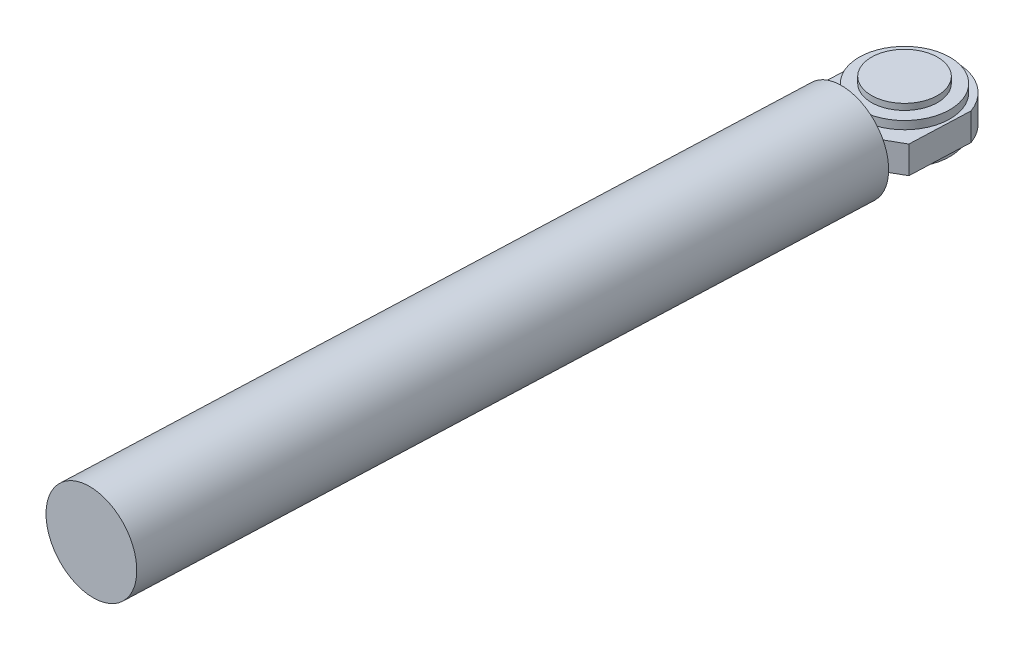
ISO-10303-21;
HEADER;
FILE_DESCRIPTION(('STEP AP214'),'2;1');
FILE_NAME('part.step','',(''),(''),'','','');
FILE_SCHEMA(('AUTOMOTIVE_DESIGN { 1 0 10303 214 1 1 1 1 }'));
ENDSEC;
DATA;
#1=APPLICATION_CONTEXT('core data for automotive mechanical design processes');
#2=APPLICATION_PROTOCOL_DEFINITION('international standard','automotive_design',2000,#1);
#3=PRODUCT_CONTEXT('',#1,'mechanical');
#4=PRODUCT('Part','Part','',(#3));
#5=PRODUCT_RELATED_PRODUCT_CATEGORY('part','',(#4));
#6=PRODUCT_DEFINITION_FORMATION('','',#4);
#7=PRODUCT_DEFINITION_CONTEXT('part definition',#1,'design');
#8=PRODUCT_DEFINITION('design','',#6,#7);
#9=PRODUCT_DEFINITION_SHAPE('','',#8);
#10=(LENGTH_UNIT() NAMED_UNIT(*) SI_UNIT(.MILLI.,.METRE.));
#11=(NAMED_UNIT(*) PLANE_ANGLE_UNIT() SI_UNIT($,.RADIAN.));
#12=(NAMED_UNIT(*) SI_UNIT($,.STERADIAN.) SOLID_ANGLE_UNIT());
#13=UNCERTAINTY_MEASURE_WITH_UNIT(LENGTH_MEASURE(1.E-05),#10,'distance_accuracy_value','');
#14=(GEOMETRIC_REPRESENTATION_CONTEXT(3) GLOBAL_UNCERTAINTY_ASSIGNED_CONTEXT((#13)) GLOBAL_UNIT_ASSIGNED_CONTEXT((#10,
#11,#12)) REPRESENTATION_CONTEXT('',''));
#15=CARTESIAN_POINT('',(0.,0.,0.));
#16=DIRECTION('',(0.,0.,1.));
#17=DIRECTION('',(1.,0.,0.));
#18=AXIS2_PLACEMENT_3D('',#15,#16,#17);
#19=CARTESIAN_POINT('',(339.664333773621,300.5,1096.72639959135));
#20=DIRECTION('',(0.,1.,0.));
#21=DIRECTION('',(0.,0.,1.));
#22=AXIS2_PLACEMENT_3D('',#19,#20,#21);
#23=PLANE('',#22);
#24=CARTESIAN_POINT('',(339.664333773621,300.5,1096.72639959135));
#25=DIRECTION('',(0.,-1.,0.));
#26=DIRECTION('',(0.,0.,-1.));
#27=AXIS2_PLACEMENT_3D('',#24,#25,#26);
#28=CIRCLE('',#27,35.0000000000001);
#29=CARTESIAN_POINT('',(339.664333773621,300.5,1061.72639959135));
#30=VERTEX_POINT('',#29);
#31=EDGE_CURVE('E18',#30,#30,#28,.T.);
#32=ORIENTED_EDGE('',*,*,#31,.F.);
#33=EDGE_LOOP('',(#32));
#34=FACE_BOUND('',#33,.T.);
#35=ADVANCED_FACE('F15',(#34),#23,.T.);
#36=CARTESIAN_POINT('',(339.664333773621,291.,1096.72639959135));
#37=DIRECTION('',(0.,-1.,0.));
#38=DIRECTION('',(0.,0.,-1.));
#39=AXIS2_PLACEMENT_3D('',#36,#37,#38);
#40=PLANE('',#39);
#41=CARTESIAN_POINT('',(339.664333773621,291.,1096.72639959135));
#42=DIRECTION('',(0.,-1.,0.));
#43=DIRECTION('',(0.,0.,-1.));
#44=AXIS2_PLACEMENT_3D('',#41,#42,#43);
#45=CIRCLE('',#44,20.);
#46=CARTESIAN_POINT('',(339.664333773621,291.,1076.72639959135));
#47=VERTEX_POINT('',#46);
#48=EDGE_CURVE('E142',#47,#47,#45,.T.);
#49=ORIENTED_EDGE('',*,*,#48,.T.);
#50=EDGE_LOOP('',(#49));
#51=FACE_BOUND('',#50,.T.);
#52=ADVANCED_FACE('F152',(#51),#40,.T.);
#53=CARTESIAN_POINT('',(339.664333773621,300.5,1096.72639959135));
#54=DIRECTION('',(0.,-1.,0.));
#55=DIRECTION('',(0.,0.,-1.));
#56=AXIS2_PLACEMENT_3D('',#53,#54,#55);
#57=CYLINDRICAL_SURFACE('',#56,35.0000000000001);
#58=CARTESIAN_POINT('',(339.664333773621,294.,1096.72639959135));
#59=DIRECTION('',(0.,-1.,0.));
#60=DIRECTION('',(0.,0.,-1.));
#61=AXIS2_PLACEMENT_3D('',#58,#59,#60);
#62=CIRCLE('',#61,35.0000000000001);
#63=CARTESIAN_POINT('',(339.664333773621,294.,1061.72639959135));
#64=VERTEX_POINT('',#63);
#65=EDGE_CURVE('E140',#64,#64,#62,.T.);
#66=ORIENTED_EDGE('',*,*,#65,.F.);
#67=EDGE_LOOP('',(#66));
#68=FACE_BOUND('',#67,.T.);
#69=ORIENTED_EDGE('',*,*,#31,.T.);
#70=EDGE_LOOP('',(#69));
#71=FACE_BOUND('',#70,.T.);
#72=ADVANCED_FACE('F149',(#68,#71),#57,.T.);
#73=CARTESIAN_POINT('',(339.664333773621,291.,1096.72639959135));
#74=DIRECTION('',(0.,-1.,0.));
#75=DIRECTION('',(0.,0.,-1.));
#76=AXIS2_PLACEMENT_3D('',#73,#74,#75);
#77=CYLINDRICAL_SURFACE('',#76,20.);
#78=CARTESIAN_POINT('',(339.664333773621,251.,1096.72639959135));
#79=DIRECTION('',(0.,-1.,0.));
#80=DIRECTION('',(0.,0.,-1.));
#81=AXIS2_PLACEMENT_3D('',#78,#79,#80);
#82=CIRCLE('',#81,20.);
#83=CARTESIAN_POINT('',(339.664333773621,251.,1076.72639959135));
#84=VERTEX_POINT('',#83);
#85=EDGE_CURVE('E94',#84,#84,#82,.F.);
#86=ORIENTED_EDGE('',*,*,#85,.F.);
#87=EDGE_LOOP('',(#86));
#88=FACE_BOUND('',#87,.T.);
#89=ORIENTED_EDGE('',*,*,#48,.F.);
#90=EDGE_LOOP('',(#89));
#91=FACE_BOUND('',#90,.T.);
#92=ADVANCED_FACE('F218',(#88,#91),#77,.F.);
#93=CARTESIAN_POINT('',(339.664333773621,294.,1096.72639959135));
#94=DIRECTION('',(0.,1.,0.));
#95=DIRECTION('',(0.,0.,1.));
#96=AXIS2_PLACEMENT_3D('',#93,#94,#95);
#97=PLANE('',#96);
#98=ORIENTED_EDGE('',*,*,#65,.T.);
#99=EDGE_LOOP('',(#98));
#100=FACE_BOUND('',#99,.T.);
#101=CARTESIAN_POINT('',(339.664333773621,294.,1096.72639959135));
#102=DIRECTION('',(0.,-1.,0.));
#103=DIRECTION('',(0.,0.,-1.));
#104=AXIS2_PLACEMENT_3D('',#101,#102,#103);
#105=CIRCLE('',#104,47.9999999999999);
#106=CARTESIAN_POINT('',(339.664333773621,294.,1048.72639959135));
#107=VERTEX_POINT('',#106);
#108=EDGE_CURVE('E89',#107,#107,#105,.T.);
#109=ORIENTED_EDGE('',*,*,#108,.F.);
#110=EDGE_LOOP('',(#109));
#111=FACE_BOUND('',#110,.T.);
#112=ADVANCED_FACE('F214',(#100,#111),#97,.T.);
#113=CARTESIAN_POINT('',(339.664333773621,251.,1096.72639959135));
#114=DIRECTION('',(0.,-1.,0.));
#115=DIRECTION('',(0.,0.,-1.));
#116=AXIS2_PLACEMENT_3D('',#113,#114,#115);
#117=PLANE('',#116);
#118=CARTESIAN_POINT('',(339.664333773621,251.,1096.72639959135));
#119=DIRECTION('',(0.,1.,0.));
#120=DIRECTION('',(0.,0.,1.));
#121=AXIS2_PLACEMENT_3D('',#118,#119,#120);
#122=CIRCLE('',#121,48.);
#123=CARTESIAN_POINT('',(339.664333773621,251.,1144.72639959135));
#124=VERTEX_POINT('',#123);
#125=EDGE_CURVE('E91',#124,#124,#122,.T.);
#126=ORIENTED_EDGE('',*,*,#125,.F.);
#127=EDGE_LOOP('',(#126));
#128=FACE_BOUND('',#127,.T.);
#129=ORIENTED_EDGE('',*,*,#85,.T.);
#130=EDGE_LOOP('',(#129));
#131=FACE_BOUND('',#130,.T.);
#132=ADVANCED_FACE('F210',(#128,#131),#117,.T.);
#133=CARTESIAN_POINT('',(339.664333773621,294.,1096.72639959135));
#134=DIRECTION('',(0.,-1.,0.));
#135=DIRECTION('',(0.,0.,-1.));
#136=AXIS2_PLACEMENT_3D('',#133,#134,#135);
#137=CYLINDRICAL_SURFACE('',#136,47.9999999999999);
#138=ORIENTED_EDGE('',*,*,#108,.T.);
#139=EDGE_LOOP('',(#138));
#140=FACE_BOUND('',#139,.T.);
#141=CARTESIAN_POINT('',(339.664333773621,285.5,1096.72639959135));
#142=DIRECTION('',(0.,-1.,0.));
#143=DIRECTION('',(0.,0.,-1.));
#144=AXIS2_PLACEMENT_3D('',#141,#142,#143);
#145=CIRCLE('',#144,47.9999999999999);
#146=CARTESIAN_POINT('',(339.664333773621,285.5,1048.72639959135));
#147=VERTEX_POINT('',#146);
#148=EDGE_CURVE('E119',#147,#147,#145,.F.);
#149=ORIENTED_EDGE('',*,*,#148,.T.);
#150=EDGE_LOOP('',(#149));
#151=FACE_BOUND('',#150,.T.);
#152=ADVANCED_FACE('F207',(#140,#151),#137,.T.);
#153=CARTESIAN_POINT('',(289.522498474665,437.578400833254,1074.12559533901));
#154=DIRECTION('',(-0.999210791136705,0.,-0.0397214661859302));
#155=DIRECTION('',(-0.0397214661859302,0.,0.999210791136705));
#156=AXIS2_PLACEMENT_3D('',#153,#154,#155);
#157=PLANE('',#156);
#158=DIRECTION('',(0.,1.,0.));
#159=VECTOR('',#158,1.);
#160=CARTESIAN_POINT('',(287.009386079447,437.578400833254,1137.34403276744));
#161=LINE('',#160,#159);
#162=CARTESIAN_POINT('',(287.009386079447,285.5,1137.34403276744));
#163=VERTEX_POINT('',#162);
#164=CARTESIAN_POINT('',(287.009386079447,256.5,1137.34403276744));
#165=VERTEX_POINT('',#164);
#166=EDGE_CURVE('E82',#163,#165,#161,.F.);
#167=ORIENTED_EDGE('',*,*,#166,.F.);
#168=DIRECTION('',(0.0397214661859306,0.,-0.999210791136705));
#169=VECTOR('',#168,1.);
#170=CARTESIAN_POINT('',(287.009386079447,285.5,1137.34403276744));
#171=LINE('',#170,#169);
#172=CARTESIAN_POINT('',(289.522498474665,285.5,1074.12559533901));
#173=VERTEX_POINT('',#172);
#174=EDGE_CURVE('E72',#163,#173,#171,.T.);
#175=ORIENTED_EDGE('',*,*,#174,.T.);
#176=DIRECTION('',(0.,-1.,0.));
#177=VECTOR('',#176,1.);
#178=CARTESIAN_POINT('',(289.522498474665,302.,1074.12559533901));
#179=LINE('',#178,#177);
#180=CARTESIAN_POINT('',(289.522498474665,256.5,1074.12559533901));
#181=VERTEX_POINT('',#180);
#182=EDGE_CURVE('E80',#181,#173,#179,.F.);
#183=ORIENTED_EDGE('',*,*,#182,.F.);
#184=DIRECTION('',(0.0397214661859306,0.,-0.999210791136705));
#185=VECTOR('',#184,1.);
#186=CARTESIAN_POINT('',(287.009386079447,256.5,1137.34403276744));
#187=LINE('',#186,#185);
#188=EDGE_CURVE('E102',#165,#181,#187,.T.);
#189=ORIENTED_EDGE('',*,*,#188,.F.);
#190=EDGE_LOOP('',(#167,#175,#183,#189));
#191=FACE_BOUND('',#190,.T.);
#192=ADVANCED_FACE('F78',(#191),#157,.T.);
#193=CARTESIAN_POINT('',(339.664333773621,302.,1096.72639959135));
#194=DIRECTION('',(0.,-1.,0.));
#195=DIRECTION('',(0.,0.,-1.));
#196=AXIS2_PLACEMENT_3D('',#193,#194,#195);
#197=CYLINDRICAL_SURFACE('',#196,54.9999999999999);
#198=DIRECTION('',(0.,1.,0.));
#199=VECTOR('',#198,1.);
#200=CARTESIAN_POINT('',(391.441999170609,437.578400833254,1078.17718488998));
#201=LINE('',#200,#199);
#202=CARTESIAN_POINT('',(391.441999170609,256.5,1078.17718488998));
#203=VERTEX_POINT('',#202);
#204=CARTESIAN_POINT('',(391.441999170609,285.5,1078.17718488998));
#205=VERTEX_POINT('',#204);
#206=EDGE_CURVE('E88',#203,#205,#201,.T.);
#207=ORIENTED_EDGE('',*,*,#206,.F.);
#208=CARTESIAN_POINT('',(339.664333773621,256.5,1096.72639959135));
#209=DIRECTION('',(0.,-1.,0.));
#210=DIRECTION('',(0.,0.,-1.));
#211=AXIS2_PLACEMENT_3D('',#208,#209,#210);
#212=CIRCLE('',#211,54.9999999999999);
#213=EDGE_CURVE('E87',#181,#203,#212,.T.);
#214=ORIENTED_EDGE('',*,*,#213,.F.);
#215=ORIENTED_EDGE('',*,*,#182,.T.);
#216=CARTESIAN_POINT('',(339.664333773621,285.5,1096.72639959135));
#217=DIRECTION('',(0.,-1.,0.));
#218=DIRECTION('',(0.,0.,-1.));
#219=AXIS2_PLACEMENT_3D('',#216,#217,#218);
#220=CIRCLE('',#219,54.9999999999999);
#221=EDGE_CURVE('E64',#173,#205,#220,.T.);
#222=ORIENTED_EDGE('',*,*,#221,.T.);
#223=EDGE_LOOP('',(#207,#214,#215,#222));
#224=FACE_BOUND('',#223,.T.);
#225=ADVANCED_FACE('F85',(#224),#197,.T.);
#226=CARTESIAN_POINT('',(391.441999170609,437.578400833254,1078.17718488998));
#227=DIRECTION('',(0.999210791136705,0.,0.0397214661859304));
#228=DIRECTION('',(0.0397214661859304,0.,-0.999210791136705));
#229=AXIS2_PLACEMENT_3D('',#226,#227,#228);
#230=PLANE('',#229);
#231=DIRECTION('',(0.,1.,0.));
#232=VECTOR('',#231,1.);
#233=CARTESIAN_POINT('',(388.928886775391,437.578400833254,1141.39562231841));
#234=LINE('',#233,#232);
#235=CARTESIAN_POINT('',(388.928886775391,256.5,1141.39562231841));
#236=VERTEX_POINT('',#235);
#237=CARTESIAN_POINT('',(388.928886775391,285.5,1141.39562231841));
#238=VERTEX_POINT('',#237);
#239=EDGE_CURVE('E113',#236,#238,#234,.T.);
#240=ORIENTED_EDGE('',*,*,#239,.F.);
#241=DIRECTION('',(-0.0397214661859315,0.,0.999210791136705));
#242=VECTOR('',#241,1.);
#243=CARTESIAN_POINT('',(391.441999170609,256.5,1078.17718488998));
#244=LINE('',#243,#242);
#245=EDGE_CURVE('E132',#203,#236,#244,.T.);
#246=ORIENTED_EDGE('',*,*,#245,.F.);
#247=ORIENTED_EDGE('',*,*,#206,.T.);
#248=DIRECTION('',(-0.0397214661859315,0.,0.999210791136705));
#249=VECTOR('',#248,1.);
#250=CARTESIAN_POINT('',(391.441999170609,285.5,1078.17718488998));
#251=LINE('',#250,#249);
#252=EDGE_CURVE('E74',#205,#238,#251,.T.);
#253=ORIENTED_EDGE('',*,*,#252,.T.);
#254=EDGE_LOOP('',(#240,#246,#247,#253));
#255=FACE_BOUND('',#254,.T.);
#256=ADVANCED_FACE('F198',(#255),#230,.T.);
#257=CARTESIAN_POINT('',(339.664333773621,251.,1096.72639959135));
#258=DIRECTION('',(0.,1.,0.));
#259=DIRECTION('',(0.,0.,1.));
#260=AXIS2_PLACEMENT_3D('',#257,#258,#259);
#261=CYLINDRICAL_SURFACE('',#260,48.);
#262=CARTESIAN_POINT('',(339.664333773621,256.5,1096.72639959135));
#263=DIRECTION('',(0.,1.,0.));
#264=DIRECTION('',(0.,0.,1.));
#265=AXIS2_PLACEMENT_3D('',#262,#263,#264);
#266=CIRCLE('',#265,48.);
#267=CARTESIAN_POINT('',(339.664333773621,256.5,1144.72639959135));
#268=VERTEX_POINT('',#267);
#269=EDGE_CURVE('E112',#268,#268,#266,.T.);
#270=ORIENTED_EDGE('',*,*,#269,.F.);
#271=EDGE_LOOP('',(#270));
#272=FACE_BOUND('',#271,.T.);
#273=ORIENTED_EDGE('',*,*,#125,.T.);
#274=EDGE_LOOP('',(#273));
#275=FACE_BOUND('',#274,.T.);
#276=ADVANCED_FACE('F194',(#272,#275),#261,.T.);
#277=CARTESIAN_POINT('',(287.009386079447,437.578400833254,1137.34403276744));
#278=DIRECTION('',(-0.561990236225881,0.,0.827143865592183));
#279=DIRECTION('',(0.827143865592183,0.,0.561990236225881));
#280=AXIS2_PLACEMENT_3D('',#277,#278,#279);
#281=PLANE('',#280);
#282=DIRECTION('',(-0.827143865592149,0.,-0.56199023622593));
#283=VECTOR('',#282,1.);
#284=CARTESIAN_POINT('',(310.669328002772,256.5,1153.41941808274));
#285=LINE('',#284,#283);
#286=CARTESIAN_POINT('',(310.669328002771,256.5,1153.41941808274));
#287=VERTEX_POINT('',#286);
#288=EDGE_CURVE('E99',#287,#165,#285,.T.);
#289=ORIENTED_EDGE('',*,*,#288,.F.);
#290=DIRECTION('',(0.,1.,0.));
#291=VECTOR('',#290,1.);
#292=CARTESIAN_POINT('',(310.669328002772,271.,1153.41941808274));
#293=LINE('',#292,#291);
#294=CARTESIAN_POINT('',(310.669328002772,285.5,1153.41941808274));
#295=VERTEX_POINT('',#294);
#296=EDGE_CURVE('E108',#287,#295,#293,.T.);
#297=ORIENTED_EDGE('',*,*,#296,.T.);
#298=DIRECTION('',(-0.827143865592149,0.,-0.56199023622593));
#299=VECTOR('',#298,1.);
#300=CARTESIAN_POINT('',(310.669328002772,285.5,1153.41941808274));
#301=LINE('',#300,#299);
#302=EDGE_CURVE('E121',#295,#163,#301,.T.);
#303=ORIENTED_EDGE('',*,*,#302,.T.);
#304=ORIENTED_EDGE('',*,*,#166,.T.);
#305=EDGE_LOOP('',(#289,#297,#303,#304));
#306=FACE_BOUND('',#305,.T.);
#307=ADVANCED_FACE('F190',(#306),#281,.T.);
#308=CARTESIAN_POINT('',(282.03628556131,285.5,1035.86680435897));
#309=DIRECTION('',(0.,-1.,0.));
#310=DIRECTION('',(0.,0.,-1.));
#311=AXIS2_PLACEMENT_3D('',#308,#309,#310);
#312=PLANE('',#311);
#313=ORIENTED_EDGE('',*,*,#148,.F.);
#314=EDGE_LOOP('',(#313));
#315=FACE_BOUND('',#314,.T.);
#316=DIRECTION('',(0.999210791136705,0.,0.0397214661859302));
#317=VECTOR('',#316,1.);
#318=CARTESIAN_POINT('',(369.116859790028,285.5,1155.74287343183));
#319=LINE('',#318,#317);
#320=CARTESIAN_POINT('',(364.067538053377,285.5,1155.54214855536));
#321=VERTEX_POINT('',#320);
#322=EDGE_CURVE('E111',#295,#321,#319,.T.);
#323=ORIENTED_EDGE('',*,*,#322,.T.);
#324=DIRECTION('',(0.869144656077564,0.,-0.494557950913554));
#325=VECTOR('',#324,1.);
#326=CARTESIAN_POINT('',(388.928886775391,285.5,1141.39562231841));
#327=LINE('',#326,#325);
#328=EDGE_CURVE('E116',#238,#321,#327,.F.);
#329=ORIENTED_EDGE('',*,*,#328,.F.);
#330=ORIENTED_EDGE('',*,*,#252,.F.);
#331=ORIENTED_EDGE('',*,*,#221,.F.);
#332=ORIENTED_EDGE('',*,*,#174,.F.);
#333=ORIENTED_EDGE('',*,*,#302,.F.);
#334=EDGE_LOOP('',(#323,#329,#330,#331,#332,#333));
#335=FACE_BOUND('',#334,.T.);
#336=ADVANCED_FACE('F70',(#315,#335),#312,.F.);
#337=CARTESIAN_POINT('',(388.928886775391,437.578400833254,1141.39562231841));
#338=DIRECTION('',(0.494557950913554,0.,0.869144656077564));
#339=DIRECTION('',(0.869144656077564,0.,-0.494557950913554));
#340=AXIS2_PLACEMENT_3D('',#337,#338,#339);
#341=PLANE('',#340);
#342=DIRECTION('',(-0.869144656077578,0.,0.494557950913528));
#343=VECTOR('',#342,1.);
#344=CARTESIAN_POINT('',(388.928886775391,256.5,1141.39562231841));
#345=LINE('',#344,#343);
#346=CARTESIAN_POINT('',(364.067538053377,256.5,1155.54214855536));
#347=VERTEX_POINT('',#346);
#348=EDGE_CURVE('E98',#236,#347,#345,.T.);
#349=ORIENTED_EDGE('',*,*,#348,.F.);
#350=ORIENTED_EDGE('',*,*,#239,.T.);
#351=ORIENTED_EDGE('',*,*,#328,.T.);
#352=DIRECTION('',(0.,1.,0.));
#353=VECTOR('',#352,1.);
#354=CARTESIAN_POINT('',(364.067538053377,271.,1155.54214855536));
#355=LINE('',#354,#353);
#356=EDGE_CURVE('E33',#321,#347,#355,.F.);
#357=ORIENTED_EDGE('',*,*,#356,.T.);
#358=EDGE_LOOP('',(#349,#350,#351,#357));
#359=FACE_BOUND('',#358,.T.);
#360=ADVANCED_FACE('F184',(#359),#341,.T.);
#361=CARTESIAN_POINT('',(282.03628556131,256.5,1035.86680435897));
#362=DIRECTION('',(0.,-1.,0.));
#363=DIRECTION('',(1.,0.,0.));
#364=AXIS2_PLACEMENT_3D('',#361,#362,#363);
#365=PLANE('',#364);
#366=ORIENTED_EDGE('',*,*,#269,.T.);
#367=EDGE_LOOP('',(#366));
#368=FACE_BOUND('',#367,.T.);
#369=ORIENTED_EDGE('',*,*,#213,.T.);
#370=ORIENTED_EDGE('',*,*,#245,.T.);
#371=ORIENTED_EDGE('',*,*,#348,.T.);
#372=DIRECTION('',(0.999210791136705,0.,0.0397214661859302));
#373=VECTOR('',#372,1.);
#374=CARTESIAN_POINT('',(369.116859790028,256.5,1155.74287343183));
#375=LINE('',#374,#373);
#376=EDGE_CURVE('E104',#347,#287,#375,.F.);
#377=ORIENTED_EDGE('',*,*,#376,.T.);
#378=ORIENTED_EDGE('',*,*,#288,.T.);
#379=ORIENTED_EDGE('',*,*,#188,.T.);
#380=EDGE_LOOP('',(#369,#370,#371,#377,#378,#379));
#381=FACE_BOUND('',#380,.T.);
#382=ADVANCED_FACE('F180',(#368,#381),#365,.T.);
#383=CARTESIAN_POINT('',(369.116859790028,271.,1155.74287343183));
#384=DIRECTION('',(-0.0397214661859302,0.,0.999210791136705));
#385=DIRECTION('',(0.999210791136705,0.,0.0397214661859302));
#386=AXIS2_PLACEMENT_3D('',#383,#384,#385);
#387=PLANE('',#386);
#388=CARTESIAN_POINT('',(337.368433028074,271.,1154.48078331905));
#389=DIRECTION('',(-0.0397214661859302,0.,0.999210791136705));
#390=DIRECTION('',(0.999210791136705,0.,0.0397214661859302));
#391=AXIS2_PLACEMENT_3D('',#388,#389,#390);
#392=CIRCLE('',#391,43.);
#393=CARTESIAN_POINT('',(380.334497046952,271.,1156.18880636504));
#394=VERTEX_POINT('',#393);
#395=EDGE_CURVE('E107',#394,#394,#392,.T.);
#396=ORIENTED_EDGE('',*,*,#395,.F.);
#397=EDGE_LOOP('',(#396));
#398=FACE_BOUND('',#397,.T.);
#399=ORIENTED_EDGE('',*,*,#356,.F.);
#400=ORIENTED_EDGE('',*,*,#322,.F.);
#401=ORIENTED_EDGE('',*,*,#296,.F.);
#402=ORIENTED_EDGE('',*,*,#376,.F.);
#403=EDGE_LOOP('',(#399,#400,#401,#402));
#404=FACE_BOUND('',#403,.T.);
#405=ADVANCED_FACE('F176',(#398,#404),#387,.F.);
#406=CARTESIAN_POINT('',(334.548208928873,271.,1225.42474948975));
#407=DIRECTION('',(-0.0397214661859302,0.,0.999210791136705));
#408=DIRECTION('',(0.999210791136705,0.,0.0397214661859302));
#409=AXIS2_PLACEMENT_3D('',#406,#407,#408);
#410=CYLINDRICAL_SURFACE('',#409,43.);
#411=ORIENTED_EDGE('',*,*,#395,.T.);
#412=EDGE_LOOP('',(#411));
#413=FACE_BOUND('',#412,.T.);
#414=CARTESIAN_POINT('',(337.189686430237,271.,1158.97723187916));
#415=DIRECTION('',(-0.0397214661859302,0.,0.999210791136705));
#416=DIRECTION('',(0.999210791136705,0.,0.0397214661859302));
#417=AXIS2_PLACEMENT_3D('',#414,#415,#416);
#418=CIRCLE('',#417,43.);
#419=CARTESIAN_POINT('',(380.155750449116,271.,1160.68525492516));
#420=VERTEX_POINT('',#419);
#421=EDGE_CURVE('E125',#420,#420,#418,.F.);
#422=ORIENTED_EDGE('',*,*,#421,.T.);
#423=EDGE_LOOP('',(#422));
#424=FACE_BOUND('',#423,.T.);
#425=ADVANCED_FACE('F172',(#413,#424),#410,.T.);
#426=CARTESIAN_POINT('',(306.814681237856,271.,1923.0737238614));
#427=DIRECTION('',(-0.0397214661859302,0.,0.999210791136705));
#428=DIRECTION('',(0.999210791136705,0.,0.0397214661859302));
#429=AXIS2_PLACEMENT_3D('',#426,#427,#428);
#430=PLANE('',#429);
#431=CARTESIAN_POINT('',(306.814681237856,271.,1923.0737238614));
#432=DIRECTION('',(0.0397214661859302,0.,-0.999210791136705));
#433=DIRECTION('',(-0.999210791136705,0.,-0.0397214661859302));
#434=AXIS2_PLACEMENT_3D('',#431,#432,#433);
#435=CIRCLE('',#434,50.);
#436=CARTESIAN_POINT('',(256.854141681021,271.,1921.0876505521));
#437=VERTEX_POINT('',#436);
#438=EDGE_CURVE('E24',#437,#437,#435,.T.);
#439=ORIENTED_EDGE('',*,*,#438,.F.);
#440=EDGE_LOOP('',(#439));
#441=FACE_BOUND('',#440,.T.);
#442=ADVANCED_FACE('F165',(#441),#430,.T.);
#443=CARTESIAN_POINT('',(380.155750449116,271.,1160.68525492516));
#444=DIRECTION('',(-0.0397214661859302,0.,0.999210791136705));
#445=DIRECTION('',(0.999210791136705,0.,0.0397214661859302));
#446=AXIS2_PLACEMENT_3D('',#443,#444,#445);
#447=PLANE('',#446);
#448=ORIENTED_EDGE('',*,*,#421,.F.);
#449=EDGE_LOOP('',(#448));
#450=FACE_BOUND('',#449,.T.);
#451=CARTESIAN_POINT('',(337.189686430237,271.,1158.97723187916));
#452=DIRECTION('',(0.0397214661859302,0.,-0.999210791136705));
#453=DIRECTION('',(-0.999210791136705,0.,-0.0397214661859302));
#454=AXIS2_PLACEMENT_3D('',#451,#452,#453);
#455=CIRCLE('',#454,50.);
#456=CARTESIAN_POINT('',(287.229146873402,271.,1156.99115856987));
#457=VERTEX_POINT('',#456);
#458=EDGE_CURVE('E9',#457,#457,#455,.F.);
#459=ORIENTED_EDGE('',*,*,#458,.F.);
#460=EDGE_LOOP('',(#459));
#461=FACE_BOUND('',#460,.T.);
#462=ADVANCED_FACE('F159',(#450,#461),#447,.F.);
#463=CARTESIAN_POINT('',(306.814681237856,271.,1923.0737238614));
#464=DIRECTION('',(0.0397214661859302,0.,-0.999210791136705));
#465=DIRECTION('',(-0.999210791136705,0.,-0.0397214661859302));
#466=AXIS2_PLACEMENT_3D('',#463,#464,#465);
#467=CYLINDRICAL_SURFACE('',#466,50.);
#468=ORIENTED_EDGE('',*,*,#458,.T.);
#469=EDGE_LOOP('',(#468));
#470=FACE_BOUND('',#469,.T.);
#471=ORIENTED_EDGE('',*,*,#438,.T.);
#472=EDGE_LOOP('',(#471));
#473=FACE_BOUND('',#472,.T.);
#474=ADVANCED_FACE('F157',(#470,#473),#467,.T.);
#475=CLOSED_SHELL('',(#35,#52,#72,#92,#112,#132,#152,#192,#225,#256,#276,#307,#336,#360,#382,
#405,#425,#442,#462,#474));
#476=MANIFOLD_SOLID_BREP('B1',#475);
#477=ADVANCED_BREP_SHAPE_REPRESENTATION('',(#18,#476),#14);
#478=SHAPE_DEFINITION_REPRESENTATION(#9,#477);
ENDSEC;
END-ISO-10303-21;
